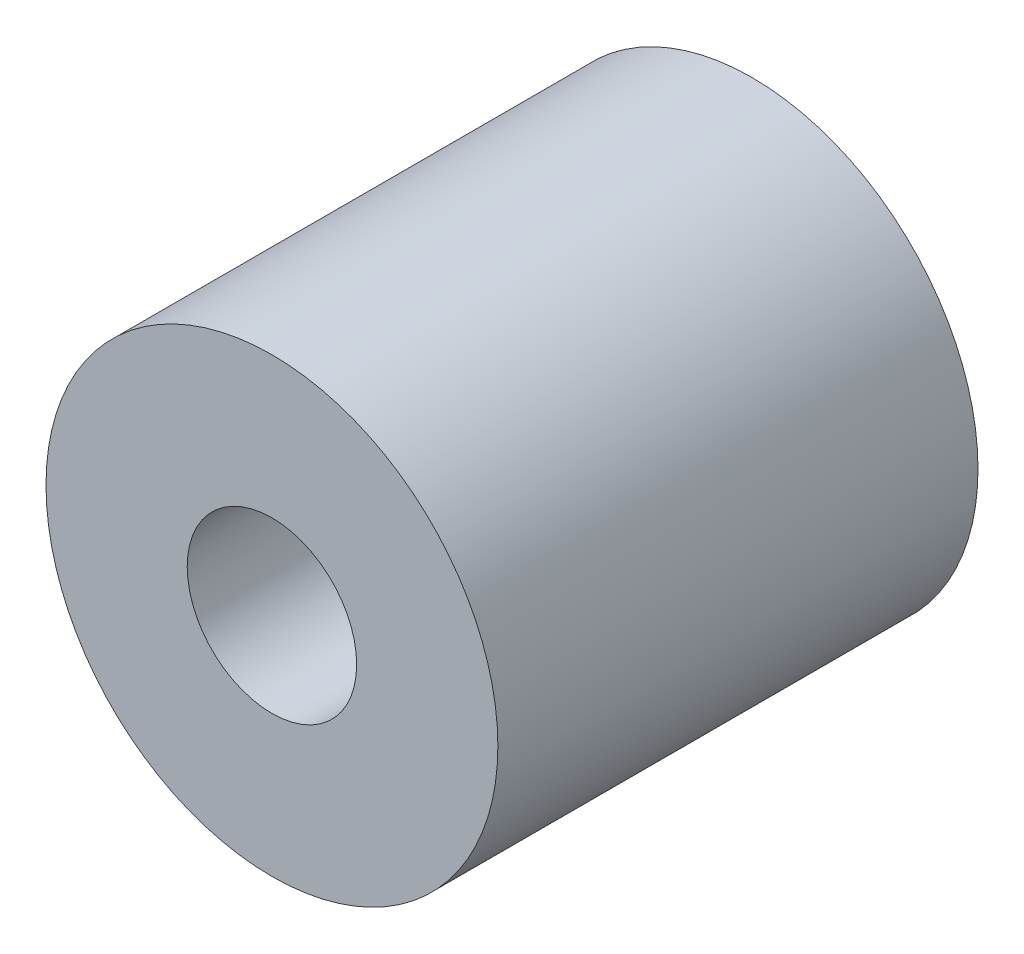
ISO-10303-21;
HEADER;
FILE_DESCRIPTION(('STEP AP214'),'2;1');
FILE_NAME('part.step','',(''),(''),'','','');
FILE_SCHEMA(('AUTOMOTIVE_DESIGN { 1 0 10303 214 1 1 1 1 }'));
ENDSEC;
DATA;
#1=APPLICATION_CONTEXT('core data for automotive mechanical design processes');
#2=APPLICATION_PROTOCOL_DEFINITION('international standard','automotive_design',2000,#1);
#3=PRODUCT_CONTEXT('',#1,'mechanical');
#4=PRODUCT('Part','Part','',(#3));
#5=PRODUCT_RELATED_PRODUCT_CATEGORY('part','',(#4));
#6=PRODUCT_DEFINITION_FORMATION('','',#4);
#7=PRODUCT_DEFINITION_CONTEXT('part definition',#1,'design');
#8=PRODUCT_DEFINITION('design','',#6,#7);
#9=PRODUCT_DEFINITION_SHAPE('','',#8);
#10=(LENGTH_UNIT() NAMED_UNIT(*) SI_UNIT(.MILLI.,.METRE.));
#11=(NAMED_UNIT(*) PLANE_ANGLE_UNIT() SI_UNIT($,.RADIAN.));
#12=(NAMED_UNIT(*) SI_UNIT($,.STERADIAN.) SOLID_ANGLE_UNIT());
#13=UNCERTAINTY_MEASURE_WITH_UNIT(LENGTH_MEASURE(1.E-05),#10,'distance_accuracy_value','');
#14=(GEOMETRIC_REPRESENTATION_CONTEXT(3) GLOBAL_UNCERTAINTY_ASSIGNED_CONTEXT((#13)) GLOBAL_UNIT_ASSIGNED_CONTEXT((#10,
#11,#12)) REPRESENTATION_CONTEXT('',''));
#15=CARTESIAN_POINT('',(0.,0.,0.));
#16=DIRECTION('',(0.,0.,1.));
#17=DIRECTION('',(1.,0.,0.));
#18=AXIS2_PLACEMENT_3D('',#15,#16,#17);
#19=CARTESIAN_POINT('',(0.,0.,8.5));
#20=DIRECTION('',(0.,0.,-1.));
#21=DIRECTION('',(-1.,0.,0.));
#22=AXIS2_PLACEMENT_3D('',#19,#20,#21);
#23=CYLINDRICAL_SURFACE('',#22,3.);
#24=CARTESIAN_POINT('',(0.,0.,0.));
#25=DIRECTION('',(0.,0.,1.));
#26=DIRECTION('',(1.,0.,0.));
#27=AXIS2_PLACEMENT_3D('',#24,#25,#26);
#28=CIRCLE('',#27,3.);
#29=CARTESIAN_POINT('',(3.,0.,0.));
#30=VERTEX_POINT('',#29);
#31=EDGE_CURVE('E52',#30,#30,#28,.T.);
#32=ORIENTED_EDGE('',*,*,#31,.F.);
#33=EDGE_LOOP('',(#32));
#34=FACE_BOUND('',#33,.T.);
#35=CARTESIAN_POINT('',(0.,0.,2.5));
#36=DIRECTION('',(0.,0.,1.));
#37=DIRECTION('',(1.,0.,0.));
#38=AXIS2_PLACEMENT_3D('',#35,#36,#37);
#39=CIRCLE('',#38,3.);
#40=CARTESIAN_POINT('',(3.,0.,2.5));
#41=VERTEX_POINT('',#40);
#42=EDGE_CURVE('E61',#41,#41,#39,.F.);
#43=ORIENTED_EDGE('',*,*,#42,.F.);
#44=EDGE_LOOP('',(#43));
#45=FACE_BOUND('',#44,.T.);
#46=ADVANCED_FACE('F39',(#34,#45),#23,.F.);
#47=CARTESIAN_POINT('',(0.,0.,8.5));
#48=DIRECTION('',(0.,0.,1.));
#49=DIRECTION('',(1.,0.,0.));
#50=AXIS2_PLACEMENT_3D('',#47,#48,#49);
#51=PLANE('',#50);
#52=CARTESIAN_POINT('',(0.,0.,8.5));
#53=DIRECTION('',(0.,0.,1.));
#54=DIRECTION('',(1.,0.,0.));
#55=AXIS2_PLACEMENT_3D('',#52,#53,#54);
#56=CIRCLE('',#55,4.);
#57=CARTESIAN_POINT('',(4.,0.,8.5));
#58=VERTEX_POINT('',#57);
#59=EDGE_CURVE('E11',#58,#58,#56,.T.);
#60=ORIENTED_EDGE('',*,*,#59,.T.);
#61=EDGE_LOOP('',(#60));
#62=FACE_BOUND('',#61,.T.);
#63=CARTESIAN_POINT('',(0.,0.,8.5));
#64=DIRECTION('',(0.,0.,1.));
#65=DIRECTION('',(1.,0.,0.));
#66=AXIS2_PLACEMENT_3D('',#63,#64,#65);
#67=CIRCLE('',#66,1.5);
#68=CARTESIAN_POINT('',(1.5,0.,8.5));
#69=VERTEX_POINT('',#68);
#70=EDGE_CURVE('E62',#69,#69,#67,.T.);
#71=ORIENTED_EDGE('',*,*,#70,.F.);
#72=EDGE_LOOP('',(#71));
#73=FACE_BOUND('',#72,.T.);
#74=ADVANCED_FACE('F74',(#62,#73),#51,.T.);
#75=CARTESIAN_POINT('',(0.,0.,0.));
#76=DIRECTION('',(0.,0.,1.));
#77=DIRECTION('',(1.,0.,0.));
#78=AXIS2_PLACEMENT_3D('',#75,#76,#77);
#79=PLANE('',#78);
#80=CARTESIAN_POINT('',(0.,0.,0.));
#81=DIRECTION('',(0.,0.,1.));
#82=DIRECTION('',(1.,0.,0.));
#83=AXIS2_PLACEMENT_3D('',#80,#81,#82);
#84=CIRCLE('',#83,4.);
#85=CARTESIAN_POINT('',(4.,0.,0.));
#86=VERTEX_POINT('',#85);
#87=EDGE_CURVE('E43',#86,#86,#84,.T.);
#88=ORIENTED_EDGE('',*,*,#87,.F.);
#89=EDGE_LOOP('',(#88));
#90=FACE_BOUND('',#89,.T.);
#91=ORIENTED_EDGE('',*,*,#31,.T.);
#92=EDGE_LOOP('',(#91));
#93=FACE_BOUND('',#92,.T.);
#94=ADVANCED_FACE('F80',(#90,#93),#79,.F.);
#95=CARTESIAN_POINT('',(0.,0.,8.5));
#96=DIRECTION('',(0.,0.,-1.));
#97=DIRECTION('',(-1.,0.,0.));
#98=AXIS2_PLACEMENT_3D('',#95,#96,#97);
#99=CYLINDRICAL_SURFACE('',#98,4.);
#100=ORIENTED_EDGE('',*,*,#59,.F.);
#101=EDGE_LOOP('',(#100));
#102=FACE_BOUND('',#101,.T.);
#103=ORIENTED_EDGE('',*,*,#87,.T.);
#104=EDGE_LOOP('',(#103));
#105=FACE_BOUND('',#104,.T.);
#106=ADVANCED_FACE('F41',(#102,#105),#99,.T.);
#107=CARTESIAN_POINT('',(0.,0.,-8.48528137423857));
#108=DIRECTION('',(0.,0.,1.));
#109=DIRECTION('',(1.,0.,0.));
#110=AXIS2_PLACEMENT_3D('',#107,#108,#109);
#111=CYLINDRICAL_SURFACE('',#110,1.5);
#112=CARTESIAN_POINT('',(0.,0.,2.5));
#113=DIRECTION('',(0.,0.,1.));
#114=DIRECTION('',(1.,0.,0.));
#115=AXIS2_PLACEMENT_3D('',#112,#113,#114);
#116=CIRCLE('',#115,1.5);
#117=CARTESIAN_POINT('',(1.5,0.,2.5));
#118=VERTEX_POINT('',#117);
#119=EDGE_CURVE('E57',#118,#118,#116,.F.);
#120=ORIENTED_EDGE('',*,*,#119,.T.);
#121=EDGE_LOOP('',(#120));
#122=FACE_BOUND('',#121,.T.);
#123=ORIENTED_EDGE('',*,*,#70,.T.);
#124=EDGE_LOOP('',(#123));
#125=FACE_BOUND('',#124,.T.);
#126=ADVANCED_FACE('F84',(#122,#125),#111,.F.);
#127=CARTESIAN_POINT('',(0.,0.,2.5));
#128=DIRECTION('',(0.,0.,1.));
#129=DIRECTION('',(1.,0.,0.));
#130=AXIS2_PLACEMENT_3D('',#127,#128,#129);
#131=PLANE('',#130);
#132=ORIENTED_EDGE('',*,*,#42,.T.);
#133=EDGE_LOOP('',(#132));
#134=FACE_BOUND('',#133,.T.);
#135=ORIENTED_EDGE('',*,*,#119,.F.);
#136=EDGE_LOOP('',(#135));
#137=FACE_BOUND('',#136,.T.);
#138=ADVANCED_FACE('F70',(#134,#137),#131,.F.);
#139=CLOSED_SHELL('',(#46,#74,#94,#106,#126,#138));
#140=MANIFOLD_SOLID_BREP('B2',#139);
#141=ADVANCED_BREP_SHAPE_REPRESENTATION('',(#18,#140),#14);
#142=SHAPE_DEFINITION_REPRESENTATION(#9,#141);
ENDSEC;
END-ISO-10303-21;
